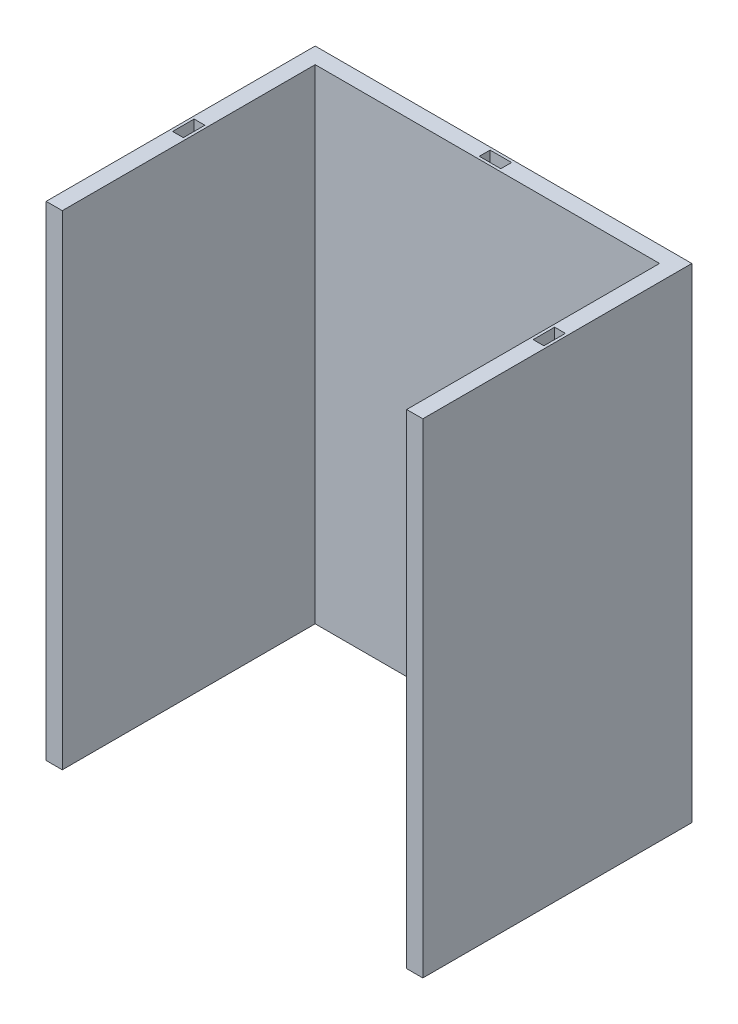
ISO-10303-21;
HEADER;
FILE_DESCRIPTION(('STEP AP214'),'2;1');
FILE_NAME('part.step','',(''),(''),'','','');
FILE_SCHEMA(('AUTOMOTIVE_DESIGN { 1 0 10303 214 1 1 1 1 }'));
ENDSEC;
DATA;
#1=APPLICATION_CONTEXT('core data for automotive mechanical design processes');
#2=APPLICATION_PROTOCOL_DEFINITION('international standard','automotive_design',2000,#1);
#3=PRODUCT_CONTEXT('',#1,'mechanical');
#4=PRODUCT('Part','Part','',(#3));
#5=PRODUCT_RELATED_PRODUCT_CATEGORY('part','',(#4));
#6=PRODUCT_DEFINITION_FORMATION('','',#4);
#7=PRODUCT_DEFINITION_CONTEXT('part definition',#1,'design');
#8=PRODUCT_DEFINITION('design','',#6,#7);
#9=PRODUCT_DEFINITION_SHAPE('','',#8);
#10=(LENGTH_UNIT() NAMED_UNIT(*) SI_UNIT(.MILLI.,.METRE.));
#11=(NAMED_UNIT(*) PLANE_ANGLE_UNIT() SI_UNIT($,.RADIAN.));
#12=(NAMED_UNIT(*) SI_UNIT($,.STERADIAN.) SOLID_ANGLE_UNIT());
#13=UNCERTAINTY_MEASURE_WITH_UNIT(LENGTH_MEASURE(1.E-05),#10,'distance_accuracy_value','');
#14=(GEOMETRIC_REPRESENTATION_CONTEXT(3) GLOBAL_UNCERTAINTY_ASSIGNED_CONTEXT((#13)) GLOBAL_UNIT_ASSIGNED_CONTEXT((#10,
#11,#12)) REPRESENTATION_CONTEXT('',''));
#15=CARTESIAN_POINT('',(0.,0.,0.));
#16=DIRECTION('',(0.,0.,1.));
#17=DIRECTION('',(1.,0.,0.));
#18=AXIS2_PLACEMENT_3D('',#15,#16,#17);
#19=CARTESIAN_POINT('',(0.,-45.,0.));
#20=DIRECTION('',(0.,1.,0.));
#21=DIRECTION('',(0.,0.,1.));
#22=AXIS2_PLACEMENT_3D('',#19,#20,#21);
#23=PLANE('',#22);
#24=DIRECTION('',(0.,0.,-1.));
#25=VECTOR('',#24,1.);
#26=CARTESIAN_POINT('',(2.,-45.,-49.5));
#27=LINE('',#26,#25);
#28=CARTESIAN_POINT('',(2.,-45.,-47.5));
#29=VERTEX_POINT('',#28);
#30=CARTESIAN_POINT('',(2.,-45.,-49.5));
#31=VERTEX_POINT('',#30);
#32=EDGE_CURVE('E62',#29,#31,#27,.T.);
#33=ORIENTED_EDGE('',*,*,#32,.T.);
#34=DIRECTION('',(-1.,0.,0.));
#35=VECTOR('',#34,1.);
#36=CARTESIAN_POINT('',(-2.,-45.,-49.5));
#37=LINE('',#36,#35);
#38=CARTESIAN_POINT('',(-2.,-45.,-49.5));
#39=VERTEX_POINT('',#38);
#40=EDGE_CURVE('E294',#31,#39,#37,.T.);
#41=ORIENTED_EDGE('',*,*,#40,.T.);
#42=DIRECTION('',(0.,0.,1.));
#43=VECTOR('',#42,1.);
#44=CARTESIAN_POINT('',(-2.,-45.,-49.5));
#45=LINE('',#44,#43);
#46=CARTESIAN_POINT('',(-2.,-45.,-47.5));
#47=VERTEX_POINT('',#46);
#48=EDGE_CURVE('E306',#39,#47,#45,.T.);
#49=ORIENTED_EDGE('',*,*,#48,.T.);
#50=DIRECTION('',(1.,0.,0.));
#51=VECTOR('',#50,1.);
#52=CARTESIAN_POINT('',(-2.,-45.,-47.5));
#53=LINE('',#52,#51);
#54=EDGE_CURVE('E302',#47,#29,#53,.T.);
#55=ORIENTED_EDGE('',*,*,#54,.T.);
#56=EDGE_LOOP('',(#33,#41,#49,#55));
#57=FACE_BOUND('',#56,.T.);
#58=DIRECTION('',(1.,0.,0.));
#59=VECTOR('',#58,1.);
#60=CARTESIAN_POINT('',(-35.,-45.,0.));
#61=LINE('',#60,#59);
#62=CARTESIAN_POINT('',(-35.,-45.,0.));
#63=VERTEX_POINT('',#62);
#64=CARTESIAN_POINT('',(-32.,-45.,0.));
#65=VERTEX_POINT('',#64);
#66=EDGE_CURVE('E374',#63,#65,#61,.T.);
#67=ORIENTED_EDGE('',*,*,#66,.F.);
#68=DIRECTION('',(0.,0.,1.));
#69=VECTOR('',#68,1.);
#70=CARTESIAN_POINT('',(-35.,-45.,0.));
#71=LINE('',#70,#69);
#72=CARTESIAN_POINT('',(-35.,-45.,-50.));
#73=VERTEX_POINT('',#72);
#74=EDGE_CURVE('E447',#73,#63,#71,.T.);
#75=ORIENTED_EDGE('',*,*,#74,.F.);
#76=DIRECTION('',(-1.,0.,0.));
#77=VECTOR('',#76,1.);
#78=CARTESIAN_POINT('',(-35.,-45.,-50.));
#79=LINE('',#78,#77);
#80=CARTESIAN_POINT('',(35.,-45.,-50.));
#81=VERTEX_POINT('',#80);
#82=EDGE_CURVE('E474',#81,#73,#79,.T.);
#83=ORIENTED_EDGE('',*,*,#82,.F.);
#84=DIRECTION('',(0.,0.,-1.));
#85=VECTOR('',#84,1.);
#86=CARTESIAN_POINT('',(35.,-45.,-50.));
#87=LINE('',#86,#85);
#88=CARTESIAN_POINT('',(35.,-45.,0.));
#89=VERTEX_POINT('',#88);
#90=EDGE_CURVE('E472',#89,#81,#87,.T.);
#91=ORIENTED_EDGE('',*,*,#90,.F.);
#92=DIRECTION('',(1.,0.,0.));
#93=VECTOR('',#92,1.);
#94=CARTESIAN_POINT('',(35.,-45.,0.));
#95=LINE('',#94,#93);
#96=CARTESIAN_POINT('',(32.,-45.,0.));
#97=VERTEX_POINT('',#96);
#98=EDGE_CURVE('E470',#97,#89,#95,.T.);
#99=ORIENTED_EDGE('',*,*,#98,.F.);
#100=DIRECTION('',(0.,0.,1.));
#101=VECTOR('',#100,1.);
#102=CARTESIAN_POINT('',(32.,-45.,-47.));
#103=LINE('',#102,#101);
#104=CARTESIAN_POINT('',(32.,-45.,-47.));
#105=VERTEX_POINT('',#104);
#106=EDGE_CURVE('E468',#105,#97,#103,.T.);
#107=ORIENTED_EDGE('',*,*,#106,.F.);
#108=DIRECTION('',(1.,0.,0.));
#109=VECTOR('',#108,1.);
#110=CARTESIAN_POINT('',(-32.,-45.,-47.));
#111=LINE('',#110,#109);
#112=CARTESIAN_POINT('',(-32.,-45.,-47.));
#113=VERTEX_POINT('',#112);
#114=EDGE_CURVE('E466',#113,#105,#111,.T.);
#115=ORIENTED_EDGE('',*,*,#114,.F.);
#116=DIRECTION('',(0.,0.,-1.));
#117=VECTOR('',#116,1.);
#118=CARTESIAN_POINT('',(-32.,-45.,0.));
#119=LINE('',#118,#117);
#120=EDGE_CURVE('E464',#65,#113,#119,.T.);
#121=ORIENTED_EDGE('',*,*,#120,.F.);
#122=EDGE_LOOP('',(#67,#75,#83,#91,#99,#107,#115,#121));
#123=FACE_BOUND('',#122,.T.);
#124=DIRECTION('',(0.,0.,-1.));
#125=VECTOR('',#124,1.);
#126=CARTESIAN_POINT('',(34.5,-45.,-27.));
#127=LINE('',#126,#125);
#128=CARTESIAN_POINT('',(34.5,-45.,-23.));
#129=VERTEX_POINT('',#128);
#130=CARTESIAN_POINT('',(34.5,-45.,-27.));
#131=VERTEX_POINT('',#130);
#132=EDGE_CURVE('E328',#129,#131,#127,.T.);
#133=ORIENTED_EDGE('',*,*,#132,.T.);
#134=DIRECTION('',(-1.,0.,0.));
#135=VECTOR('',#134,1.);
#136=CARTESIAN_POINT('',(34.5,-45.,-27.));
#137=LINE('',#136,#135);
#138=CARTESIAN_POINT('',(32.5,-45.,-27.));
#139=VERTEX_POINT('',#138);
#140=EDGE_CURVE('E321',#131,#139,#137,.T.);
#141=ORIENTED_EDGE('',*,*,#140,.T.);
#142=DIRECTION('',(0.,0.,1.));
#143=VECTOR('',#142,1.);
#144=CARTESIAN_POINT('',(32.5,-45.,-27.));
#145=LINE('',#144,#143);
#146=CARTESIAN_POINT('',(32.5,-45.,-23.));
#147=VERTEX_POINT('',#146);
#148=EDGE_CURVE('E334',#139,#147,#145,.T.);
#149=ORIENTED_EDGE('',*,*,#148,.T.);
#150=DIRECTION('',(1.,0.,0.));
#151=VECTOR('',#150,1.);
#152=CARTESIAN_POINT('',(34.5,-45.,-23.));
#153=LINE('',#152,#151);
#154=EDGE_CURVE('E331',#147,#129,#153,.T.);
#155=ORIENTED_EDGE('',*,*,#154,.T.);
#156=EDGE_LOOP('',(#133,#141,#149,#155));
#157=FACE_BOUND('',#156,.T.);
#158=DIRECTION('',(0.,0.,-1.));
#159=VECTOR('',#158,1.);
#160=CARTESIAN_POINT('',(-32.5,-45.,-27.));
#161=LINE('',#160,#159);
#162=CARTESIAN_POINT('',(-32.5,-45.,-23.));
#163=VERTEX_POINT('',#162);
#164=CARTESIAN_POINT('',(-32.5,-45.,-27.));
#165=VERTEX_POINT('',#164);
#166=EDGE_CURVE('E54',#163,#165,#161,.T.);
#167=ORIENTED_EDGE('',*,*,#166,.T.);
#168=DIRECTION('',(-1.,0.,0.));
#169=VECTOR('',#168,1.);
#170=CARTESIAN_POINT('',(-34.5,-45.,-27.));
#171=LINE('',#170,#169);
#172=CARTESIAN_POINT('',(-34.5,-45.,-27.));
#173=VERTEX_POINT('',#172);
#174=EDGE_CURVE('E270',#165,#173,#171,.T.);
#175=ORIENTED_EDGE('',*,*,#174,.T.);
#176=DIRECTION('',(0.,0.,1.));
#177=VECTOR('',#176,1.);
#178=CARTESIAN_POINT('',(-34.5,-45.,-27.));
#179=LINE('',#178,#177);
#180=CARTESIAN_POINT('',(-34.5,-45.,-23.));
#181=VERTEX_POINT('',#180);
#182=EDGE_CURVE('E273',#173,#181,#179,.T.);
#183=ORIENTED_EDGE('',*,*,#182,.T.);
#184=DIRECTION('',(1.,0.,0.));
#185=VECTOR('',#184,1.);
#186=CARTESIAN_POINT('',(-34.5,-45.,-23.));
#187=LINE('',#186,#185);
#188=EDGE_CURVE('E279',#181,#163,#187,.T.);
#189=ORIENTED_EDGE('',*,*,#188,.T.);
#190=EDGE_LOOP('',(#167,#175,#183,#189));
#191=FACE_BOUND('',#190,.T.);
#192=ADVANCED_FACE('F39',(#57,#123,#157,#191),#23,.F.);
#193=CARTESIAN_POINT('',(-35.,45.,0.));
#194=DIRECTION('',(0.,0.,-1.));
#195=DIRECTION('',(-1.,0.,0.));
#196=AXIS2_PLACEMENT_3D('',#193,#194,#195);
#197=PLANE('',#196);
#198=ORIENTED_EDGE('',*,*,#66,.T.);
#199=DIRECTION('',(0.,-1.,0.));
#200=VECTOR('',#199,1.);
#201=CARTESIAN_POINT('',(-32.,45.,0.));
#202=LINE('',#201,#200);
#203=CARTESIAN_POINT('',(-32.,45.,0.));
#204=VERTEX_POINT('',#203);
#205=EDGE_CURVE('E11',#204,#65,#202,.T.);
#206=ORIENTED_EDGE('',*,*,#205,.F.);
#207=DIRECTION('',(1.,0.,0.));
#208=VECTOR('',#207,1.);
#209=CARTESIAN_POINT('',(-35.,45.,0.));
#210=LINE('',#209,#208);
#211=CARTESIAN_POINT('',(-35.,45.,0.));
#212=VERTEX_POINT('',#211);
#213=EDGE_CURVE('E443',#212,#204,#210,.T.);
#214=ORIENTED_EDGE('',*,*,#213,.F.);
#215=DIRECTION('',(0.,-1.,0.));
#216=VECTOR('',#215,1.);
#217=CARTESIAN_POINT('',(-35.,45.,0.));
#218=LINE('',#217,#216);
#219=EDGE_CURVE('E461',#212,#63,#218,.T.);
#220=ORIENTED_EDGE('',*,*,#219,.T.);
#221=EDGE_LOOP('',(#198,#206,#214,#220));
#222=FACE_BOUND('',#221,.T.);
#223=ADVANCED_FACE('F41',(#222),#197,.F.);
#224=CARTESIAN_POINT('',(-32.,45.,0.));
#225=DIRECTION('',(-1.,0.,0.));
#226=DIRECTION('',(0.,0.,1.));
#227=AXIS2_PLACEMENT_3D('',#224,#225,#226);
#228=PLANE('',#227);
#229=ORIENTED_EDGE('',*,*,#120,.T.);
#230=DIRECTION('',(0.,-1.,0.));
#231=VECTOR('',#230,1.);
#232=CARTESIAN_POINT('',(-32.,45.,-47.));
#233=LINE('',#232,#231);
#234=CARTESIAN_POINT('',(-32.,45.,-47.));
#235=VERTEX_POINT('',#234);
#236=EDGE_CURVE('E47',#235,#113,#233,.T.);
#237=ORIENTED_EDGE('',*,*,#236,.F.);
#238=DIRECTION('',(0.,0.,-1.));
#239=VECTOR('',#238,1.);
#240=CARTESIAN_POINT('',(-32.,45.,0.));
#241=LINE('',#240,#239);
#242=EDGE_CURVE('E446',#204,#235,#241,.T.);
#243=ORIENTED_EDGE('',*,*,#242,.F.);
#244=ORIENTED_EDGE('',*,*,#205,.T.);
#245=EDGE_LOOP('',(#229,#237,#243,#244));
#246=FACE_BOUND('',#245,.T.);
#247=ADVANCED_FACE('F521',(#246),#228,.F.);
#248=CARTESIAN_POINT('',(-32.,45.,-47.));
#249=DIRECTION('',(0.,0.,-1.));
#250=DIRECTION('',(-1.,0.,0.));
#251=AXIS2_PLACEMENT_3D('',#248,#249,#250);
#252=PLANE('',#251);
#253=ORIENTED_EDGE('',*,*,#114,.T.);
#254=DIRECTION('',(0.,-1.,0.));
#255=VECTOR('',#254,1.);
#256=CARTESIAN_POINT('',(32.,45.,-47.));
#257=LINE('',#256,#255);
#258=CARTESIAN_POINT('',(32.,45.,-47.));
#259=VERTEX_POINT('',#258);
#260=EDGE_CURVE('E491',#259,#105,#257,.T.);
#261=ORIENTED_EDGE('',*,*,#260,.F.);
#262=DIRECTION('',(1.,0.,0.));
#263=VECTOR('',#262,1.);
#264=CARTESIAN_POINT('',(-32.,45.,-47.));
#265=LINE('',#264,#263);
#266=EDGE_CURVE('E449',#235,#259,#265,.T.);
#267=ORIENTED_EDGE('',*,*,#266,.F.);
#268=ORIENTED_EDGE('',*,*,#236,.T.);
#269=EDGE_LOOP('',(#253,#261,#267,#268));
#270=FACE_BOUND('',#269,.T.);
#271=ADVANCED_FACE('F498',(#270),#252,.F.);
#272=CARTESIAN_POINT('',(32.,45.,-47.));
#273=DIRECTION('',(1.,0.,0.));
#274=DIRECTION('',(0.,0.,-1.));
#275=AXIS2_PLACEMENT_3D('',#272,#273,#274);
#276=PLANE('',#275);
#277=ORIENTED_EDGE('',*,*,#106,.T.);
#278=DIRECTION('',(0.,-1.,0.));
#279=VECTOR('',#278,1.);
#280=CARTESIAN_POINT('',(32.,45.,0.));
#281=LINE('',#280,#279);
#282=CARTESIAN_POINT('',(32.,45.,0.));
#283=VERTEX_POINT('',#282);
#284=EDGE_CURVE('E488',#283,#97,#281,.T.);
#285=ORIENTED_EDGE('',*,*,#284,.F.);
#286=DIRECTION('',(0.,0.,1.));
#287=VECTOR('',#286,1.);
#288=CARTESIAN_POINT('',(32.,45.,-47.));
#289=LINE('',#288,#287);
#290=EDGE_CURVE('E451',#259,#283,#289,.T.);
#291=ORIENTED_EDGE('',*,*,#290,.F.);
#292=ORIENTED_EDGE('',*,*,#260,.T.);
#293=EDGE_LOOP('',(#277,#285,#291,#292));
#294=FACE_BOUND('',#293,.T.);
#295=ADVANCED_FACE('F509',(#294),#276,.F.);
#296=CARTESIAN_POINT('',(35.,45.,0.));
#297=DIRECTION('',(0.,0.,-1.));
#298=DIRECTION('',(-1.,0.,0.));
#299=AXIS2_PLACEMENT_3D('',#296,#297,#298);
#300=PLANE('',#299);
#301=ORIENTED_EDGE('',*,*,#98,.T.);
#302=DIRECTION('',(0.,-1.,0.));
#303=VECTOR('',#302,1.);
#304=CARTESIAN_POINT('',(35.,45.,0.));
#305=LINE('',#304,#303);
#306=CARTESIAN_POINT('',(35.,45.,0.));
#307=VERTEX_POINT('',#306);
#308=EDGE_CURVE('E485',#307,#89,#305,.T.);
#309=ORIENTED_EDGE('',*,*,#308,.F.);
#310=DIRECTION('',(1.,0.,0.));
#311=VECTOR('',#310,1.);
#312=CARTESIAN_POINT('',(35.,45.,0.));
#313=LINE('',#312,#311);
#314=EDGE_CURVE('E453',#283,#307,#313,.T.);
#315=ORIENTED_EDGE('',*,*,#314,.F.);
#316=ORIENTED_EDGE('',*,*,#284,.T.);
#317=EDGE_LOOP('',(#301,#309,#315,#316));
#318=FACE_BOUND('',#317,.T.);
#319=ADVANCED_FACE('F513',(#318),#300,.F.);
#320=CARTESIAN_POINT('',(35.,45.,-50.));
#321=DIRECTION('',(-1.,0.,0.));
#322=DIRECTION('',(0.,0.,1.));
#323=AXIS2_PLACEMENT_3D('',#320,#321,#322);
#324=PLANE('',#323);
#325=ORIENTED_EDGE('',*,*,#90,.T.);
#326=DIRECTION('',(0.,-1.,0.));
#327=VECTOR('',#326,1.);
#328=CARTESIAN_POINT('',(35.,45.,-50.));
#329=LINE('',#328,#327);
#330=CARTESIAN_POINT('',(35.,45.,-50.));
#331=VERTEX_POINT('',#330);
#332=EDGE_CURVE('E482',#331,#81,#329,.T.);
#333=ORIENTED_EDGE('',*,*,#332,.F.);
#334=DIRECTION('',(0.,0.,-1.));
#335=VECTOR('',#334,1.);
#336=CARTESIAN_POINT('',(35.,45.,-50.));
#337=LINE('',#336,#335);
#338=EDGE_CURVE('E455',#307,#331,#337,.T.);
#339=ORIENTED_EDGE('',*,*,#338,.F.);
#340=ORIENTED_EDGE('',*,*,#308,.T.);
#341=EDGE_LOOP('',(#325,#333,#339,#340));
#342=FACE_BOUND('',#341,.T.);
#343=ADVANCED_FACE('F534',(#342),#324,.F.);
#344=CARTESIAN_POINT('',(-35.,45.,-50.));
#345=DIRECTION('',(0.,0.,1.));
#346=DIRECTION('',(1.,0.,0.));
#347=AXIS2_PLACEMENT_3D('',#344,#345,#346);
#348=PLANE('',#347);
#349=ORIENTED_EDGE('',*,*,#82,.T.);
#350=DIRECTION('',(0.,-1.,0.));
#351=VECTOR('',#350,1.);
#352=CARTESIAN_POINT('',(-35.,45.,-50.));
#353=LINE('',#352,#351);
#354=CARTESIAN_POINT('',(-35.,45.,-50.));
#355=VERTEX_POINT('',#354);
#356=EDGE_CURVE('E479',#355,#73,#353,.T.);
#357=ORIENTED_EDGE('',*,*,#356,.F.);
#358=DIRECTION('',(-1.,0.,0.));
#359=VECTOR('',#358,1.);
#360=CARTESIAN_POINT('',(-35.,45.,-50.));
#361=LINE('',#360,#359);
#362=EDGE_CURVE('E457',#331,#355,#361,.T.);
#363=ORIENTED_EDGE('',*,*,#362,.F.);
#364=ORIENTED_EDGE('',*,*,#332,.T.);
#365=EDGE_LOOP('',(#349,#357,#363,#364));
#366=FACE_BOUND('',#365,.T.);
#367=ADVANCED_FACE('F532',(#366),#348,.F.);
#368=CARTESIAN_POINT('',(-35.,45.,0.));
#369=DIRECTION('',(1.,0.,0.));
#370=DIRECTION('',(0.,0.,-1.));
#371=AXIS2_PLACEMENT_3D('',#368,#369,#370);
#372=PLANE('',#371);
#373=ORIENTED_EDGE('',*,*,#74,.T.);
#374=ORIENTED_EDGE('',*,*,#219,.F.);
#375=DIRECTION('',(0.,0.,1.));
#376=VECTOR('',#375,1.);
#377=CARTESIAN_POINT('',(-35.,45.,0.));
#378=LINE('',#377,#376);
#379=EDGE_CURVE('E459',#355,#212,#378,.T.);
#380=ORIENTED_EDGE('',*,*,#379,.F.);
#381=ORIENTED_EDGE('',*,*,#356,.T.);
#382=EDGE_LOOP('',(#373,#374,#380,#381));
#383=FACE_BOUND('',#382,.T.);
#384=ADVANCED_FACE('F527',(#383),#372,.F.);
#385=CARTESIAN_POINT('',(0.,45.,0.));
#386=DIRECTION('',(0.,1.,0.));
#387=DIRECTION('',(0.,0.,1.));
#388=AXIS2_PLACEMENT_3D('',#385,#386,#387);
#389=PLANE('',#388);
#390=DIRECTION('',(0.,0.,-1.));
#391=VECTOR('',#390,1.);
#392=CARTESIAN_POINT('',(-32.5,45.,-27.));
#393=LINE('',#392,#391);
#394=CARTESIAN_POINT('',(-32.5,45.,-23.));
#395=VERTEX_POINT('',#394);
#396=CARTESIAN_POINT('',(-32.5,45.,-27.));
#397=VERTEX_POINT('',#396);
#398=EDGE_CURVE('E361',#395,#397,#393,.T.);
#399=ORIENTED_EDGE('',*,*,#398,.F.);
#400=DIRECTION('',(1.,0.,0.));
#401=VECTOR('',#400,1.);
#402=CARTESIAN_POINT('',(-34.5,45.,-23.));
#403=LINE('',#402,#401);
#404=CARTESIAN_POINT('',(-34.5,45.,-23.));
#405=VERTEX_POINT('',#404);
#406=EDGE_CURVE('E351',#405,#395,#403,.T.);
#407=ORIENTED_EDGE('',*,*,#406,.F.);
#408=DIRECTION('',(0.,0.,1.));
#409=VECTOR('',#408,1.);
#410=CARTESIAN_POINT('',(-34.5,45.,-27.));
#411=LINE('',#410,#409);
#412=CARTESIAN_POINT('',(-34.5,45.,-27.));
#413=VERTEX_POINT('',#412);
#414=EDGE_CURVE('E367',#413,#405,#411,.T.);
#415=ORIENTED_EDGE('',*,*,#414,.F.);
#416=DIRECTION('',(-1.,0.,0.));
#417=VECTOR('',#416,1.);
#418=CARTESIAN_POINT('',(-34.5,45.,-27.));
#419=LINE('',#418,#417);
#420=EDGE_CURVE('E363',#397,#413,#419,.T.);
#421=ORIENTED_EDGE('',*,*,#420,.F.);
#422=EDGE_LOOP('',(#399,#407,#415,#421));
#423=FACE_BOUND('',#422,.T.);
#424=DIRECTION('',(0.,0.,-1.));
#425=VECTOR('',#424,1.);
#426=CARTESIAN_POINT('',(2.,45.,-49.5));
#427=LINE('',#426,#425);
#428=CARTESIAN_POINT('',(2.,45.,-47.5));
#429=VERTEX_POINT('',#428);
#430=CARTESIAN_POINT('',(2.,45.,-49.5));
#431=VERTEX_POINT('',#430);
#432=EDGE_CURVE('E364',#429,#431,#427,.T.);
#433=ORIENTED_EDGE('',*,*,#432,.F.);
#434=DIRECTION('',(1.,0.,0.));
#435=VECTOR('',#434,1.);
#436=CARTESIAN_POINT('',(-2.,45.,-47.5));
#437=LINE('',#436,#435);
#438=CARTESIAN_POINT('',(-2.,45.,-47.5));
#439=VERTEX_POINT('',#438);
#440=EDGE_CURVE('E392',#439,#429,#437,.T.);
#441=ORIENTED_EDGE('',*,*,#440,.F.);
#442=DIRECTION('',(0.,0.,1.));
#443=VECTOR('',#442,1.);
#444=CARTESIAN_POINT('',(-2.,45.,-49.5));
#445=LINE('',#444,#443);
#446=CARTESIAN_POINT('',(-2.,45.,-49.5));
#447=VERTEX_POINT('',#446);
#448=EDGE_CURVE('E395',#447,#439,#445,.T.);
#449=ORIENTED_EDGE('',*,*,#448,.F.);
#450=DIRECTION('',(-1.,0.,0.));
#451=VECTOR('',#450,1.);
#452=CARTESIAN_POINT('',(-2.,45.,-49.5));
#453=LINE('',#452,#451);
#454=EDGE_CURVE('E399',#431,#447,#453,.T.);
#455=ORIENTED_EDGE('',*,*,#454,.F.);
#456=EDGE_LOOP('',(#433,#441,#449,#455));
#457=FACE_BOUND('',#456,.T.);
#458=DIRECTION('',(0.,0.,-1.));
#459=VECTOR('',#458,1.);
#460=CARTESIAN_POINT('',(34.5,45.,-27.));
#461=LINE('',#460,#459);
#462=CARTESIAN_POINT('',(34.5,45.,-23.));
#463=VERTEX_POINT('',#462);
#464=CARTESIAN_POINT('',(34.5,45.,-27.));
#465=VERTEX_POINT('',#464);
#466=EDGE_CURVE('E391',#463,#465,#461,.T.);
#467=ORIENTED_EDGE('',*,*,#466,.F.);
#468=DIRECTION('',(1.,0.,0.));
#469=VECTOR('',#468,1.);
#470=CARTESIAN_POINT('',(34.5,45.,-23.));
#471=LINE('',#470,#469);
#472=CARTESIAN_POINT('',(32.5,45.,-23.));
#473=VERTEX_POINT('',#472);
#474=EDGE_CURVE('E422',#473,#463,#471,.T.);
#475=ORIENTED_EDGE('',*,*,#474,.F.);
#476=DIRECTION('',(0.,0.,1.));
#477=VECTOR('',#476,1.);
#478=CARTESIAN_POINT('',(32.5,45.,-27.));
#479=LINE('',#478,#477);
#480=CARTESIAN_POINT('',(32.5,45.,-27.));
#481=VERTEX_POINT('',#480);
#482=EDGE_CURVE('E425',#481,#473,#479,.T.);
#483=ORIENTED_EDGE('',*,*,#482,.F.);
#484=DIRECTION('',(-1.,0.,0.));
#485=VECTOR('',#484,1.);
#486=CARTESIAN_POINT('',(34.5,45.,-27.));
#487=LINE('',#486,#485);
#488=EDGE_CURVE('E429',#465,#481,#487,.T.);
#489=ORIENTED_EDGE('',*,*,#488,.F.);
#490=EDGE_LOOP('',(#467,#475,#483,#489));
#491=FACE_BOUND('',#490,.T.);
#492=ORIENTED_EDGE('',*,*,#213,.T.);
#493=ORIENTED_EDGE('',*,*,#242,.T.);
#494=ORIENTED_EDGE('',*,*,#266,.T.);
#495=ORIENTED_EDGE('',*,*,#290,.T.);
#496=ORIENTED_EDGE('',*,*,#314,.T.);
#497=ORIENTED_EDGE('',*,*,#338,.T.);
#498=ORIENTED_EDGE('',*,*,#362,.T.);
#499=ORIENTED_EDGE('',*,*,#379,.T.);
#500=EDGE_LOOP('',(#492,#493,#494,#495,#496,#497,#498,#499));
#501=FACE_BOUND('',#500,.T.);
#502=ADVANCED_FACE('F517',(#423,#457,#491,#501),#389,.T.);
#503=CARTESIAN_POINT('',(34.5,42.,-27.));
#504=DIRECTION('',(1.,0.,0.));
#505=DIRECTION('',(0.,0.,-1.));
#506=AXIS2_PLACEMENT_3D('',#503,#504,#505);
#507=PLANE('',#506);
#508=ORIENTED_EDGE('',*,*,#466,.T.);
#509=DIRECTION('',(0.,1.,0.));
#510=VECTOR('',#509,1.);
#511=CARTESIAN_POINT('',(34.5,42.,-27.));
#512=LINE('',#511,#510);
#513=CARTESIAN_POINT('',(34.5,42.,-27.));
#514=VERTEX_POINT('',#513);
#515=EDGE_CURVE('E413',#514,#465,#512,.T.);
#516=ORIENTED_EDGE('',*,*,#515,.F.);
#517=DIRECTION('',(0.,0.,-1.));
#518=VECTOR('',#517,1.);
#519=CARTESIAN_POINT('',(34.5,42.,-27.));
#520=LINE('',#519,#518);
#521=CARTESIAN_POINT('',(34.5,42.,-23.));
#522=VERTEX_POINT('',#521);
#523=EDGE_CURVE('E426',#522,#514,#520,.T.);
#524=ORIENTED_EDGE('',*,*,#523,.F.);
#525=DIRECTION('',(0.,1.,0.));
#526=VECTOR('',#525,1.);
#527=CARTESIAN_POINT('',(34.5,42.,-23.));
#528=LINE('',#527,#526);
#529=EDGE_CURVE('E286',#522,#463,#528,.T.);
#530=ORIENTED_EDGE('',*,*,#529,.T.);
#531=EDGE_LOOP('',(#508,#516,#524,#530));
#532=FACE_BOUND('',#531,.T.);
#533=ADVANCED_FACE('F558',(#532),#507,.F.);
#534=CARTESIAN_POINT('',(34.5,42.,-23.));
#535=DIRECTION('',(0.,0.,1.));
#536=DIRECTION('',(1.,0.,0.));
#537=AXIS2_PLACEMENT_3D('',#534,#535,#536);
#538=PLANE('',#537);
#539=ORIENTED_EDGE('',*,*,#474,.T.);
#540=ORIENTED_EDGE('',*,*,#529,.F.);
#541=DIRECTION('',(1.,0.,0.));
#542=VECTOR('',#541,1.);
#543=CARTESIAN_POINT('',(34.5,42.,-23.));
#544=LINE('',#543,#542);
#545=CARTESIAN_POINT('',(32.5,42.,-23.));
#546=VERTEX_POINT('',#545);
#547=EDGE_CURVE('E416',#546,#522,#544,.T.);
#548=ORIENTED_EDGE('',*,*,#547,.F.);
#549=DIRECTION('',(0.,1.,0.));
#550=VECTOR('',#549,1.);
#551=CARTESIAN_POINT('',(32.5,42.,-23.));
#552=LINE('',#551,#550);
#553=EDGE_CURVE('E419',#546,#473,#552,.T.);
#554=ORIENTED_EDGE('',*,*,#553,.T.);
#555=EDGE_LOOP('',(#539,#540,#548,#554));
#556=FACE_BOUND('',#555,.T.);
#557=ADVANCED_FACE('F563',(#556),#538,.F.);
#558=CARTESIAN_POINT('',(32.5,42.,-27.));
#559=DIRECTION('',(-1.,0.,0.));
#560=DIRECTION('',(0.,0.,1.));
#561=AXIS2_PLACEMENT_3D('',#558,#559,#560);
#562=PLANE('',#561);
#563=ORIENTED_EDGE('',*,*,#482,.T.);
#564=ORIENTED_EDGE('',*,*,#553,.F.);
#565=DIRECTION('',(0.,0.,1.));
#566=VECTOR('',#565,1.);
#567=CARTESIAN_POINT('',(32.5,42.,-27.));
#568=LINE('',#567,#566);
#569=CARTESIAN_POINT('',(32.5,42.,-27.));
#570=VERTEX_POINT('',#569);
#571=EDGE_CURVE('E435',#570,#546,#568,.T.);
#572=ORIENTED_EDGE('',*,*,#571,.F.);
#573=DIRECTION('',(0.,1.,0.));
#574=VECTOR('',#573,1.);
#575=CARTESIAN_POINT('',(32.5,42.,-27.));
#576=LINE('',#575,#574);
#577=EDGE_CURVE('E417',#570,#481,#576,.T.);
#578=ORIENTED_EDGE('',*,*,#577,.T.);
#579=EDGE_LOOP('',(#563,#564,#572,#578));
#580=FACE_BOUND('',#579,.T.);
#581=ADVANCED_FACE('F588',(#580),#562,.F.);
#582=CARTESIAN_POINT('',(34.5,42.,-27.));
#583=DIRECTION('',(0.,0.,-1.));
#584=DIRECTION('',(-1.,0.,0.));
#585=AXIS2_PLACEMENT_3D('',#582,#583,#584);
#586=PLANE('',#585);
#587=ORIENTED_EDGE('',*,*,#488,.T.);
#588=ORIENTED_EDGE('',*,*,#577,.F.);
#589=DIRECTION('',(-1.,0.,0.));
#590=VECTOR('',#589,1.);
#591=CARTESIAN_POINT('',(34.5,42.,-27.));
#592=LINE('',#591,#590);
#593=EDGE_CURVE('E438',#514,#570,#592,.T.);
#594=ORIENTED_EDGE('',*,*,#593,.F.);
#595=ORIENTED_EDGE('',*,*,#515,.T.);
#596=EDGE_LOOP('',(#587,#588,#594,#595));
#597=FACE_BOUND('',#596,.T.);
#598=ADVANCED_FACE('F581',(#597),#586,.F.);
#599=CARTESIAN_POINT('',(0.,42.,0.));
#600=DIRECTION('',(0.,-1.,0.));
#601=DIRECTION('',(0.,0.,-1.));
#602=AXIS2_PLACEMENT_3D('',#599,#600,#601);
#603=PLANE('',#602);
#604=ORIENTED_EDGE('',*,*,#523,.T.);
#605=ORIENTED_EDGE('',*,*,#593,.T.);
#606=ORIENTED_EDGE('',*,*,#571,.T.);
#607=ORIENTED_EDGE('',*,*,#547,.T.);
#608=EDGE_LOOP('',(#604,#605,#606,#607));
#609=FACE_BOUND('',#608,.T.);
#610=ADVANCED_FACE('F584',(#609),#603,.F.);
#611=CARTESIAN_POINT('',(2.,42.,-49.5));
#612=DIRECTION('',(1.,0.,0.));
#613=DIRECTION('',(0.,0.,-1.));
#614=AXIS2_PLACEMENT_3D('',#611,#612,#613);
#615=PLANE('',#614);
#616=ORIENTED_EDGE('',*,*,#432,.T.);
#617=DIRECTION('',(0.,1.,0.));
#618=VECTOR('',#617,1.);
#619=CARTESIAN_POINT('',(2.,42.,-49.5));
#620=LINE('',#619,#618);
#621=CARTESIAN_POINT('',(2.,42.,-49.5));
#622=VERTEX_POINT('',#621);
#623=EDGE_CURVE('E381',#622,#431,#620,.T.);
#624=ORIENTED_EDGE('',*,*,#623,.F.);
#625=DIRECTION('',(0.,0.,-1.));
#626=VECTOR('',#625,1.);
#627=CARTESIAN_POINT('',(2.,42.,-49.5));
#628=LINE('',#627,#626);
#629=CARTESIAN_POINT('',(2.,42.,-47.5));
#630=VERTEX_POINT('',#629);
#631=EDGE_CURVE('E396',#630,#622,#628,.T.);
#632=ORIENTED_EDGE('',*,*,#631,.F.);
#633=DIRECTION('',(0.,1.,0.));
#634=VECTOR('',#633,1.);
#635=CARTESIAN_POINT('',(2.,42.,-47.5));
#636=LINE('',#635,#634);
#637=EDGE_CURVE('E389',#630,#429,#636,.T.);
#638=ORIENTED_EDGE('',*,*,#637,.T.);
#639=EDGE_LOOP('',(#616,#624,#632,#638));
#640=FACE_BOUND('',#639,.T.);
#641=ADVANCED_FACE('F598',(#640),#615,.F.);
#642=CARTESIAN_POINT('',(-2.,42.,-47.5));
#643=DIRECTION('',(0.,0.,1.));
#644=DIRECTION('',(1.,0.,0.));
#645=AXIS2_PLACEMENT_3D('',#642,#643,#644);
#646=PLANE('',#645);
#647=ORIENTED_EDGE('',*,*,#440,.T.);
#648=ORIENTED_EDGE('',*,*,#637,.F.);
#649=DIRECTION('',(1.,0.,0.));
#650=VECTOR('',#649,1.);
#651=CARTESIAN_POINT('',(-2.,42.,-47.5));
#652=LINE('',#651,#650);
#653=CARTESIAN_POINT('',(-2.,42.,-47.5));
#654=VERTEX_POINT('',#653);
#655=EDGE_CURVE('E384',#654,#630,#652,.T.);
#656=ORIENTED_EDGE('',*,*,#655,.F.);
#657=DIRECTION('',(0.,1.,0.));
#658=VECTOR('',#657,1.);
#659=CARTESIAN_POINT('',(-2.,42.,-47.5));
#660=LINE('',#659,#658);
#661=EDGE_CURVE('E387',#654,#439,#660,.T.);
#662=ORIENTED_EDGE('',*,*,#661,.T.);
#663=EDGE_LOOP('',(#647,#648,#656,#662));
#664=FACE_BOUND('',#663,.T.);
#665=ADVANCED_FACE('F602',(#664),#646,.F.);
#666=CARTESIAN_POINT('',(-2.,42.,-49.5));
#667=DIRECTION('',(-1.,0.,0.));
#668=DIRECTION('',(0.,0.,1.));
#669=AXIS2_PLACEMENT_3D('',#666,#667,#668);
#670=PLANE('',#669);
#671=ORIENTED_EDGE('',*,*,#448,.T.);
#672=ORIENTED_EDGE('',*,*,#661,.F.);
#673=DIRECTION('',(0.,0.,1.));
#674=VECTOR('',#673,1.);
#675=CARTESIAN_POINT('',(-2.,42.,-49.5));
#676=LINE('',#675,#674);
#677=CARTESIAN_POINT('',(-2.,42.,-49.5));
#678=VERTEX_POINT('',#677);
#679=EDGE_CURVE('E405',#678,#654,#676,.T.);
#680=ORIENTED_EDGE('',*,*,#679,.F.);
#681=DIRECTION('',(0.,1.,0.));
#682=VECTOR('',#681,1.);
#683=CARTESIAN_POINT('',(-2.,42.,-49.5));
#684=LINE('',#683,#682);
#685=EDGE_CURVE('E385',#678,#447,#684,.T.);
#686=ORIENTED_EDGE('',*,*,#685,.T.);
#687=EDGE_LOOP('',(#671,#672,#680,#686));
#688=FACE_BOUND('',#687,.T.);
#689=ADVANCED_FACE('F608',(#688),#670,.F.);
#690=CARTESIAN_POINT('',(-2.,42.,-49.5));
#691=DIRECTION('',(0.,0.,-1.));
#692=DIRECTION('',(-1.,0.,0.));
#693=AXIS2_PLACEMENT_3D('',#690,#691,#692);
#694=PLANE('',#693);
#695=ORIENTED_EDGE('',*,*,#454,.T.);
#696=ORIENTED_EDGE('',*,*,#685,.F.);
#697=DIRECTION('',(-1.,0.,0.));
#698=VECTOR('',#697,1.);
#699=CARTESIAN_POINT('',(-2.,42.,-49.5));
#700=LINE('',#699,#698);
#701=EDGE_CURVE('E408',#622,#678,#700,.T.);
#702=ORIENTED_EDGE('',*,*,#701,.F.);
#703=ORIENTED_EDGE('',*,*,#623,.T.);
#704=EDGE_LOOP('',(#695,#696,#702,#703));
#705=FACE_BOUND('',#704,.T.);
#706=ADVANCED_FACE('F615',(#705),#694,.F.);
#707=CARTESIAN_POINT('',(0.,42.,0.));
#708=DIRECTION('',(0.,1.,0.));
#709=DIRECTION('',(0.,0.,1.));
#710=AXIS2_PLACEMENT_3D('',#707,#708,#709);
#711=PLANE('',#710);
#712=ORIENTED_EDGE('',*,*,#631,.T.);
#713=ORIENTED_EDGE('',*,*,#701,.T.);
#714=ORIENTED_EDGE('',*,*,#679,.T.);
#715=ORIENTED_EDGE('',*,*,#655,.T.);
#716=EDGE_LOOP('',(#712,#713,#714,#715));
#717=FACE_BOUND('',#716,.T.);
#718=ADVANCED_FACE('F618',(#717),#711,.T.);
#719=CARTESIAN_POINT('',(-32.5,42.,-27.));
#720=DIRECTION('',(1.,0.,0.));
#721=DIRECTION('',(0.,0.,-1.));
#722=AXIS2_PLACEMENT_3D('',#719,#720,#721);
#723=PLANE('',#722);
#724=ORIENTED_EDGE('',*,*,#398,.T.);
#725=DIRECTION('',(0.,1.,0.));
#726=VECTOR('',#725,1.);
#727=CARTESIAN_POINT('',(-32.5,42.,-27.));
#728=LINE('',#727,#726);
#729=CARTESIAN_POINT('',(-32.5,42.,-27.));
#730=VERTEX_POINT('',#729);
#731=EDGE_CURVE('E360',#730,#397,#728,.T.);
#732=ORIENTED_EDGE('',*,*,#731,.F.);
#733=DIRECTION('',(0.,0.,-1.));
#734=VECTOR('',#733,1.);
#735=CARTESIAN_POINT('',(-32.5,42.,-27.));
#736=LINE('',#735,#734);
#737=CARTESIAN_POINT('',(-32.5,42.,-23.));
#738=VERTEX_POINT('',#737);
#739=EDGE_CURVE('E347',#738,#730,#736,.T.);
#740=ORIENTED_EDGE('',*,*,#739,.F.);
#741=DIRECTION('',(0.,1.,0.));
#742=VECTOR('',#741,1.);
#743=CARTESIAN_POINT('',(-32.5,42.,-23.));
#744=LINE('',#743,#742);
#745=EDGE_CURVE('E372',#738,#395,#744,.T.);
#746=ORIENTED_EDGE('',*,*,#745,.T.);
#747=EDGE_LOOP('',(#724,#732,#740,#746));
#748=FACE_BOUND('',#747,.T.);
#749=ADVANCED_FACE('F613',(#748),#723,.F.);
#750=CARTESIAN_POINT('',(-34.5,42.,-23.));
#751=DIRECTION('',(0.,0.,1.));
#752=DIRECTION('',(1.,0.,0.));
#753=AXIS2_PLACEMENT_3D('',#750,#751,#752);
#754=PLANE('',#753);
#755=ORIENTED_EDGE('',*,*,#406,.T.);
#756=ORIENTED_EDGE('',*,*,#745,.F.);
#757=DIRECTION('',(1.,0.,0.));
#758=VECTOR('',#757,1.);
#759=CARTESIAN_POINT('',(-34.5,42.,-23.));
#760=LINE('',#759,#758);
#761=CARTESIAN_POINT('',(-34.5,42.,-23.));
#762=VERTEX_POINT('',#761);
#763=EDGE_CURVE('E357',#762,#738,#760,.T.);
#764=ORIENTED_EDGE('',*,*,#763,.F.);
#765=DIRECTION('',(0.,1.,0.));
#766=VECTOR('',#765,1.);
#767=CARTESIAN_POINT('',(-34.5,42.,-23.));
#768=LINE('',#767,#766);
#769=EDGE_CURVE('E375',#762,#405,#768,.T.);
#770=ORIENTED_EDGE('',*,*,#769,.T.);
#771=EDGE_LOOP('',(#755,#756,#764,#770));
#772=FACE_BOUND('',#771,.T.);
#773=ADVANCED_FACE('F628',(#772),#754,.F.);
#774=CARTESIAN_POINT('',(-34.5,42.,-27.));
#775=DIRECTION('',(-1.,0.,0.));
#776=DIRECTION('',(0.,0.,1.));
#777=AXIS2_PLACEMENT_3D('',#774,#775,#776);
#778=PLANE('',#777);
#779=ORIENTED_EDGE('',*,*,#414,.T.);
#780=ORIENTED_EDGE('',*,*,#769,.F.);
#781=DIRECTION('',(0.,0.,1.));
#782=VECTOR('',#781,1.);
#783=CARTESIAN_POINT('',(-34.5,42.,-27.));
#784=LINE('',#783,#782);
#785=CARTESIAN_POINT('',(-34.5,42.,-27.));
#786=VERTEX_POINT('',#785);
#787=EDGE_CURVE('E354',#786,#762,#784,.T.);
#788=ORIENTED_EDGE('',*,*,#787,.F.);
#789=DIRECTION('',(0.,1.,0.));
#790=VECTOR('',#789,1.);
#791=CARTESIAN_POINT('',(-34.5,42.,-27.));
#792=LINE('',#791,#790);
#793=EDGE_CURVE('E377',#786,#413,#792,.T.);
#794=ORIENTED_EDGE('',*,*,#793,.T.);
#795=EDGE_LOOP('',(#779,#780,#788,#794));
#796=FACE_BOUND('',#795,.T.);
#797=ADVANCED_FACE('F638',(#796),#778,.F.);
#798=CARTESIAN_POINT('',(-34.5,42.,-27.));
#799=DIRECTION('',(0.,0.,-1.));
#800=DIRECTION('',(-1.,0.,0.));
#801=AXIS2_PLACEMENT_3D('',#798,#799,#800);
#802=PLANE('',#801);
#803=ORIENTED_EDGE('',*,*,#420,.T.);
#804=ORIENTED_EDGE('',*,*,#793,.F.);
#805=DIRECTION('',(-1.,0.,0.));
#806=VECTOR('',#805,1.);
#807=CARTESIAN_POINT('',(-34.5,42.,-27.));
#808=LINE('',#807,#806);
#809=EDGE_CURVE('E350',#730,#786,#808,.T.);
#810=ORIENTED_EDGE('',*,*,#809,.F.);
#811=ORIENTED_EDGE('',*,*,#731,.T.);
#812=EDGE_LOOP('',(#803,#804,#810,#811));
#813=FACE_BOUND('',#812,.T.);
#814=ADVANCED_FACE('F644',(#813),#802,.F.);
#815=CARTESIAN_POINT('',(0.,42.,0.));
#816=DIRECTION('',(0.,1.,0.));
#817=DIRECTION('',(0.,0.,1.));
#818=AXIS2_PLACEMENT_3D('',#815,#816,#817);
#819=PLANE('',#818);
#820=ORIENTED_EDGE('',*,*,#739,.T.);
#821=ORIENTED_EDGE('',*,*,#809,.T.);
#822=ORIENTED_EDGE('',*,*,#787,.T.);
#823=ORIENTED_EDGE('',*,*,#763,.T.);
#824=EDGE_LOOP('',(#820,#821,#822,#823));
#825=FACE_BOUND('',#824,.T.);
#826=ADVANCED_FACE('F650',(#825),#819,.T.);
#827=CARTESIAN_POINT('',(34.5,-42.,-27.));
#828=DIRECTION('',(-1.,0.,0.));
#829=DIRECTION('',(0.,0.,1.));
#830=AXIS2_PLACEMENT_3D('',#827,#828,#829);
#831=PLANE('',#830);
#832=ORIENTED_EDGE('',*,*,#132,.F.);
#833=DIRECTION('',(0.,-1.,0.));
#834=VECTOR('',#833,1.);
#835=CARTESIAN_POINT('',(34.5,-42.,-23.));
#836=LINE('',#835,#834);
#837=CARTESIAN_POINT('',(34.5,-42.,-23.));
#838=VERTEX_POINT('',#837);
#839=EDGE_CURVE('E327',#838,#129,#836,.T.);
#840=ORIENTED_EDGE('',*,*,#839,.F.);
#841=DIRECTION('',(0.,0.,-1.));
#842=VECTOR('',#841,1.);
#843=CARTESIAN_POINT('',(34.5,-42.,-27.));
#844=LINE('',#843,#842);
#845=CARTESIAN_POINT('',(34.5,-42.,-27.));
#846=VERTEX_POINT('',#845);
#847=EDGE_CURVE('E317',#838,#846,#844,.T.);
#848=ORIENTED_EDGE('',*,*,#847,.T.);
#849=DIRECTION('',(0.,-1.,0.));
#850=VECTOR('',#849,1.);
#851=CARTESIAN_POINT('',(34.5,-42.,-27.));
#852=LINE('',#851,#850);
#853=EDGE_CURVE('E303',#846,#131,#852,.T.);
#854=ORIENTED_EDGE('',*,*,#853,.T.);
#855=EDGE_LOOP('',(#832,#840,#848,#854));
#856=FACE_BOUND('',#855,.T.);
#857=ADVANCED_FACE('F651',(#856),#831,.T.);
#858=CARTESIAN_POINT('',(34.5,-42.,-27.));
#859=DIRECTION('',(0.,0.,1.));
#860=DIRECTION('',(1.,0.,0.));
#861=AXIS2_PLACEMENT_3D('',#858,#859,#860);
#862=PLANE('',#861);
#863=ORIENTED_EDGE('',*,*,#140,.F.);
#864=ORIENTED_EDGE('',*,*,#853,.F.);
#865=DIRECTION('',(-1.,0.,0.));
#866=VECTOR('',#865,1.);
#867=CARTESIAN_POINT('',(34.5,-42.,-27.));
#868=LINE('',#867,#866);
#869=CARTESIAN_POINT('',(32.5,-42.,-27.));
#870=VERTEX_POINT('',#869);
#871=EDGE_CURVE('E325',#846,#870,#868,.T.);
#872=ORIENTED_EDGE('',*,*,#871,.T.);
#873=DIRECTION('',(0.,-1.,0.));
#874=VECTOR('',#873,1.);
#875=CARTESIAN_POINT('',(32.5,-42.,-27.));
#876=LINE('',#875,#874);
#877=EDGE_CURVE('E341',#870,#139,#876,.T.);
#878=ORIENTED_EDGE('',*,*,#877,.T.);
#879=EDGE_LOOP('',(#863,#864,#872,#878));
#880=FACE_BOUND('',#879,.T.);
#881=ADVANCED_FACE('F656',(#880),#862,.T.);
#882=CARTESIAN_POINT('',(32.5,-42.,-27.));
#883=DIRECTION('',(1.,0.,0.));
#884=DIRECTION('',(0.,0.,-1.));
#885=AXIS2_PLACEMENT_3D('',#882,#883,#884);
#886=PLANE('',#885);
#887=ORIENTED_EDGE('',*,*,#148,.F.);
#888=ORIENTED_EDGE('',*,*,#877,.F.);
#889=DIRECTION('',(0.,0.,1.));
#890=VECTOR('',#889,1.);
#891=CARTESIAN_POINT('',(32.5,-42.,-27.));
#892=LINE('',#891,#890);
#893=CARTESIAN_POINT('',(32.5,-42.,-23.));
#894=VERTEX_POINT('',#893);
#895=EDGE_CURVE('E323',#870,#894,#892,.T.);
#896=ORIENTED_EDGE('',*,*,#895,.T.);
#897=DIRECTION('',(0.,-1.,0.));
#898=VECTOR('',#897,1.);
#899=CARTESIAN_POINT('',(32.5,-42.,-23.));
#900=LINE('',#899,#898);
#901=EDGE_CURVE('E343',#894,#147,#900,.T.);
#902=ORIENTED_EDGE('',*,*,#901,.T.);
#903=EDGE_LOOP('',(#887,#888,#896,#902));
#904=FACE_BOUND('',#903,.T.);
#905=ADVANCED_FACE('F695',(#904),#886,.T.);
#906=CARTESIAN_POINT('',(34.5,-42.,-23.));
#907=DIRECTION('',(0.,0.,-1.));
#908=DIRECTION('',(-1.,0.,0.));
#909=AXIS2_PLACEMENT_3D('',#906,#907,#908);
#910=PLANE('',#909);
#911=ORIENTED_EDGE('',*,*,#154,.F.);
#912=ORIENTED_EDGE('',*,*,#901,.F.);
#913=DIRECTION('',(1.,0.,0.));
#914=VECTOR('',#913,1.);
#915=CARTESIAN_POINT('',(34.5,-42.,-23.));
#916=LINE('',#915,#914);
#917=EDGE_CURVE('E320',#894,#838,#916,.T.);
#918=ORIENTED_EDGE('',*,*,#917,.T.);
#919=ORIENTED_EDGE('',*,*,#839,.T.);
#920=EDGE_LOOP('',(#911,#912,#918,#919));
#921=FACE_BOUND('',#920,.T.);
#922=ADVANCED_FACE('F705',(#921),#910,.T.);
#923=CARTESIAN_POINT('',(0.,-42.,0.));
#924=DIRECTION('',(0.,1.,0.));
#925=DIRECTION('',(0.,0.,-1.));
#926=AXIS2_PLACEMENT_3D('',#923,#924,#925);
#927=PLANE('',#926);
#928=ORIENTED_EDGE('',*,*,#847,.F.);
#929=ORIENTED_EDGE('',*,*,#917,.F.);
#930=ORIENTED_EDGE('',*,*,#895,.F.);
#931=ORIENTED_EDGE('',*,*,#871,.F.);
#932=EDGE_LOOP('',(#928,#929,#930,#931));
#933=FACE_BOUND('',#932,.T.);
#934=ADVANCED_FACE('F715',(#933),#927,.F.);
#935=CARTESIAN_POINT('',(2.,-42.,-49.5));
#936=DIRECTION('',(-1.,0.,0.));
#937=DIRECTION('',(0.,0.,1.));
#938=AXIS2_PLACEMENT_3D('',#935,#936,#937);
#939=PLANE('',#938);
#940=ORIENTED_EDGE('',*,*,#32,.F.);
#941=DIRECTION('',(0.,-1.,0.));
#942=VECTOR('',#941,1.);
#943=CARTESIAN_POINT('',(2.,-42.,-47.5));
#944=LINE('',#943,#942);
#945=CARTESIAN_POINT('',(2.,-42.,-47.5));
#946=VERTEX_POINT('',#945);
#947=EDGE_CURVE('E300',#946,#29,#944,.T.);
#948=ORIENTED_EDGE('',*,*,#947,.F.);
#949=DIRECTION('',(0.,0.,-1.));
#950=VECTOR('',#949,1.);
#951=CARTESIAN_POINT('',(2.,-42.,-49.5));
#952=LINE('',#951,#950);
#953=CARTESIAN_POINT('',(2.,-42.,-49.5));
#954=VERTEX_POINT('',#953);
#955=EDGE_CURVE('E290',#946,#954,#952,.T.);
#956=ORIENTED_EDGE('',*,*,#955,.T.);
#957=DIRECTION('',(0.,-1.,0.));
#958=VECTOR('',#957,1.);
#959=CARTESIAN_POINT('',(2.,-42.,-49.5));
#960=LINE('',#959,#958);
#961=EDGE_CURVE('E280',#954,#31,#960,.T.);
#962=ORIENTED_EDGE('',*,*,#961,.T.);
#963=EDGE_LOOP('',(#940,#948,#956,#962));
#964=FACE_BOUND('',#963,.T.);
#965=ADVANCED_FACE('F724',(#964),#939,.T.);
#966=CARTESIAN_POINT('',(-2.,-42.,-49.5));
#967=DIRECTION('',(0.,0.,1.));
#968=DIRECTION('',(1.,0.,0.));
#969=AXIS2_PLACEMENT_3D('',#966,#967,#968);
#970=PLANE('',#969);
#971=ORIENTED_EDGE('',*,*,#40,.F.);
#972=ORIENTED_EDGE('',*,*,#961,.F.);
#973=DIRECTION('',(-1.,0.,0.));
#974=VECTOR('',#973,1.);
#975=CARTESIAN_POINT('',(-2.,-42.,-49.5));
#976=LINE('',#975,#974);
#977=CARTESIAN_POINT('',(-2.,-42.,-49.5));
#978=VERTEX_POINT('',#977);
#979=EDGE_CURVE('E298',#954,#978,#976,.T.);
#980=ORIENTED_EDGE('',*,*,#979,.T.);
#981=DIRECTION('',(0.,-1.,0.));
#982=VECTOR('',#981,1.);
#983=CARTESIAN_POINT('',(-2.,-42.,-49.5));
#984=LINE('',#983,#982);
#985=EDGE_CURVE('E312',#978,#39,#984,.T.);
#986=ORIENTED_EDGE('',*,*,#985,.T.);
#987=EDGE_LOOP('',(#971,#972,#980,#986));
#988=FACE_BOUND('',#987,.T.);
#989=ADVANCED_FACE('F734',(#988),#970,.T.);
#990=CARTESIAN_POINT('',(-2.,-42.,-49.5));
#991=DIRECTION('',(1.,0.,0.));
#992=DIRECTION('',(0.,0.,-1.));
#993=AXIS2_PLACEMENT_3D('',#990,#991,#992);
#994=PLANE('',#993);
#995=ORIENTED_EDGE('',*,*,#48,.F.);
#996=ORIENTED_EDGE('',*,*,#985,.F.);
#997=DIRECTION('',(0.,0.,1.));
#998=VECTOR('',#997,1.);
#999=CARTESIAN_POINT('',(-2.,-42.,-49.5));
#1000=LINE('',#999,#998);
#1001=CARTESIAN_POINT('',(-2.,-42.,-47.5));
#1002=VERTEX_POINT('',#1001);
#1003=EDGE_CURVE('E296',#978,#1002,#1000,.T.);
#1004=ORIENTED_EDGE('',*,*,#1003,.T.);
#1005=DIRECTION('',(0.,-1.,0.));
#1006=VECTOR('',#1005,1.);
#1007=CARTESIAN_POINT('',(-2.,-42.,-47.5));
#1008=LINE('',#1007,#1006);
#1009=EDGE_CURVE('E314',#1002,#47,#1008,.T.);
#1010=ORIENTED_EDGE('',*,*,#1009,.T.);
#1011=EDGE_LOOP('',(#995,#996,#1004,#1010));
#1012=FACE_BOUND('',#1011,.T.);
#1013=ADVANCED_FACE('F743',(#1012),#994,.T.);
#1014=CARTESIAN_POINT('',(-2.,-42.,-47.5));
#1015=DIRECTION('',(0.,0.,-1.));
#1016=DIRECTION('',(-1.,0.,0.));
#1017=AXIS2_PLACEMENT_3D('',#1014,#1015,#1016);
#1018=PLANE('',#1017);
#1019=ORIENTED_EDGE('',*,*,#54,.F.);
#1020=ORIENTED_EDGE('',*,*,#1009,.F.);
#1021=DIRECTION('',(1.,0.,0.));
#1022=VECTOR('',#1021,1.);
#1023=CARTESIAN_POINT('',(-2.,-42.,-47.5));
#1024=LINE('',#1023,#1022);
#1025=EDGE_CURVE('E293',#1002,#946,#1024,.T.);
#1026=ORIENTED_EDGE('',*,*,#1025,.T.);
#1027=ORIENTED_EDGE('',*,*,#947,.T.);
#1028=EDGE_LOOP('',(#1019,#1020,#1026,#1027));
#1029=FACE_BOUND('',#1028,.T.);
#1030=ADVANCED_FACE('F753',(#1029),#1018,.T.);
#1031=CARTESIAN_POINT('',(0.,-42.,0.));
#1032=DIRECTION('',(0.,-1.,0.));
#1033=DIRECTION('',(0.,0.,1.));
#1034=AXIS2_PLACEMENT_3D('',#1031,#1032,#1033);
#1035=PLANE('',#1034);
#1036=ORIENTED_EDGE('',*,*,#955,.F.);
#1037=ORIENTED_EDGE('',*,*,#1025,.F.);
#1038=ORIENTED_EDGE('',*,*,#1003,.F.);
#1039=ORIENTED_EDGE('',*,*,#979,.F.);
#1040=EDGE_LOOP('',(#1036,#1037,#1038,#1039));
#1041=FACE_BOUND('',#1040,.T.);
#1042=ADVANCED_FACE('F763',(#1041),#1035,.T.);
#1043=CARTESIAN_POINT('',(-32.5,-42.,-27.));
#1044=DIRECTION('',(-1.,0.,0.));
#1045=DIRECTION('',(0.,0.,1.));
#1046=AXIS2_PLACEMENT_3D('',#1043,#1044,#1045);
#1047=PLANE('',#1046);
#1048=ORIENTED_EDGE('',*,*,#166,.F.);
#1049=DIRECTION('',(0.,-1.,0.));
#1050=VECTOR('',#1049,1.);
#1051=CARTESIAN_POINT('',(-32.5,-42.,-23.));
#1052=LINE('',#1051,#1050);
#1053=CARTESIAN_POINT('',(-32.5,-42.,-23.));
#1054=VERTEX_POINT('',#1053);
#1055=EDGE_CURVE('E255',#1054,#163,#1052,.T.);
#1056=ORIENTED_EDGE('',*,*,#1055,.F.);
#1057=DIRECTION('',(0.,0.,-1.));
#1058=VECTOR('',#1057,1.);
#1059=CARTESIAN_POINT('',(-32.5,-42.,-27.));
#1060=LINE('',#1059,#1058);
#1061=CARTESIAN_POINT('',(-32.5,-42.,-27.));
#1062=VERTEX_POINT('',#1061);
#1063=EDGE_CURVE('E262',#1054,#1062,#1060,.T.);
#1064=ORIENTED_EDGE('',*,*,#1063,.T.);
#1065=DIRECTION('',(0.,-1.,0.));
#1066=VECTOR('',#1065,1.);
#1067=CARTESIAN_POINT('',(-32.5,-42.,-27.));
#1068=LINE('',#1067,#1066);
#1069=EDGE_CURVE('E284',#1062,#165,#1068,.T.);
#1070=ORIENTED_EDGE('',*,*,#1069,.T.);
#1071=EDGE_LOOP('',(#1048,#1056,#1064,#1070));
#1072=FACE_BOUND('',#1071,.T.);
#1073=ADVANCED_FACE('F265',(#1072),#1047,.T.);
#1074=CARTESIAN_POINT('',(-34.5,-42.,-27.));
#1075=DIRECTION('',(0.,0.,1.));
#1076=DIRECTION('',(1.,0.,0.));
#1077=AXIS2_PLACEMENT_3D('',#1074,#1075,#1076);
#1078=PLANE('',#1077);
#1079=ORIENTED_EDGE('',*,*,#174,.F.);
#1080=ORIENTED_EDGE('',*,*,#1069,.F.);
#1081=DIRECTION('',(-1.,0.,0.));
#1082=VECTOR('',#1081,1.);
#1083=CARTESIAN_POINT('',(-34.5,-42.,-27.));
#1084=LINE('',#1083,#1082);
#1085=CARTESIAN_POINT('',(-34.5,-42.,-27.));
#1086=VERTEX_POINT('',#1085);
#1087=EDGE_CURVE('E267',#1062,#1086,#1084,.T.);
#1088=ORIENTED_EDGE('',*,*,#1087,.T.);
#1089=DIRECTION('',(0.,-1.,0.));
#1090=VECTOR('',#1089,1.);
#1091=CARTESIAN_POINT('',(-34.5,-42.,-27.));
#1092=LINE('',#1091,#1090);
#1093=EDGE_CURVE('E287',#1086,#173,#1092,.T.);
#1094=ORIENTED_EDGE('',*,*,#1093,.T.);
#1095=EDGE_LOOP('',(#1079,#1080,#1088,#1094));
#1096=FACE_BOUND('',#1095,.T.);
#1097=ADVANCED_FACE('F782',(#1096),#1078,.T.);
#1098=CARTESIAN_POINT('',(-34.5,-42.,-27.));
#1099=DIRECTION('',(1.,0.,0.));
#1100=DIRECTION('',(0.,0.,-1.));
#1101=AXIS2_PLACEMENT_3D('',#1098,#1099,#1100);
#1102=PLANE('',#1101);
#1103=ORIENTED_EDGE('',*,*,#182,.F.);
#1104=ORIENTED_EDGE('',*,*,#1093,.F.);
#1105=DIRECTION('',(0.,0.,1.));
#1106=VECTOR('',#1105,1.);
#1107=CARTESIAN_POINT('',(-34.5,-42.,-27.));
#1108=LINE('',#1107,#1106);
#1109=CARTESIAN_POINT('',(-34.5,-42.,-23.));
#1110=VERTEX_POINT('',#1109);
#1111=EDGE_CURVE('E261',#1086,#1110,#1108,.T.);
#1112=ORIENTED_EDGE('',*,*,#1111,.T.);
#1113=DIRECTION('',(0.,-1.,0.));
#1114=VECTOR('',#1113,1.);
#1115=CARTESIAN_POINT('',(-34.5,-42.,-23.));
#1116=LINE('',#1115,#1114);
#1117=EDGE_CURVE('E257',#1110,#181,#1116,.T.);
#1118=ORIENTED_EDGE('',*,*,#1117,.T.);
#1119=EDGE_LOOP('',(#1103,#1104,#1112,#1118));
#1120=FACE_BOUND('',#1119,.T.);
#1121=ADVANCED_FACE('F791',(#1120),#1102,.T.);
#1122=CARTESIAN_POINT('',(-34.5,-42.,-23.));
#1123=DIRECTION('',(0.,0.,-1.));
#1124=DIRECTION('',(-1.,0.,0.));
#1125=AXIS2_PLACEMENT_3D('',#1122,#1123,#1124);
#1126=PLANE('',#1125);
#1127=ORIENTED_EDGE('',*,*,#188,.F.);
#1128=ORIENTED_EDGE('',*,*,#1117,.F.);
#1129=DIRECTION('',(1.,0.,0.));
#1130=VECTOR('',#1129,1.);
#1131=CARTESIAN_POINT('',(-34.5,-42.,-23.));
#1132=LINE('',#1131,#1130);
#1133=EDGE_CURVE('E252',#1110,#1054,#1132,.T.);
#1134=ORIENTED_EDGE('',*,*,#1133,.T.);
#1135=ORIENTED_EDGE('',*,*,#1055,.T.);
#1136=EDGE_LOOP('',(#1127,#1128,#1134,#1135));
#1137=FACE_BOUND('',#1136,.T.);
#1138=ADVANCED_FACE('F254',(#1137),#1126,.T.);
#1139=CARTESIAN_POINT('',(0.,-42.,0.));
#1140=DIRECTION('',(0.,-1.,0.));
#1141=DIRECTION('',(0.,0.,1.));
#1142=AXIS2_PLACEMENT_3D('',#1139,#1140,#1141);
#1143=PLANE('',#1142);
#1144=ORIENTED_EDGE('',*,*,#1063,.F.);
#1145=ORIENTED_EDGE('',*,*,#1133,.F.);
#1146=ORIENTED_EDGE('',*,*,#1111,.F.);
#1147=ORIENTED_EDGE('',*,*,#1087,.F.);
#1148=EDGE_LOOP('',(#1144,#1145,#1146,#1147));
#1149=FACE_BOUND('',#1148,.T.);
#1150=ADVANCED_FACE('F269',(#1149),#1143,.T.);
#1151=CLOSED_SHELL('',(#192,#223,#247,#271,#295,#319,#343,#367,#384,#502,#533,#557,#581,#598,
#610,#641,#665,#689,#706,#718,#749,#773,#797,#814,#826,#857,#881,#905,#922,#934,#965,#989,#1013,
#1030,#1042,#1073,#1097,#1121,#1138,#1150));
#1152=MANIFOLD_SOLID_BREP('B2',#1151);
#1153=ADVANCED_BREP_SHAPE_REPRESENTATION('',(#18,#1152),#14);
#1154=SHAPE_DEFINITION_REPRESENTATION(#9,#1153);
ENDSEC;
END-ISO-10303-21;
